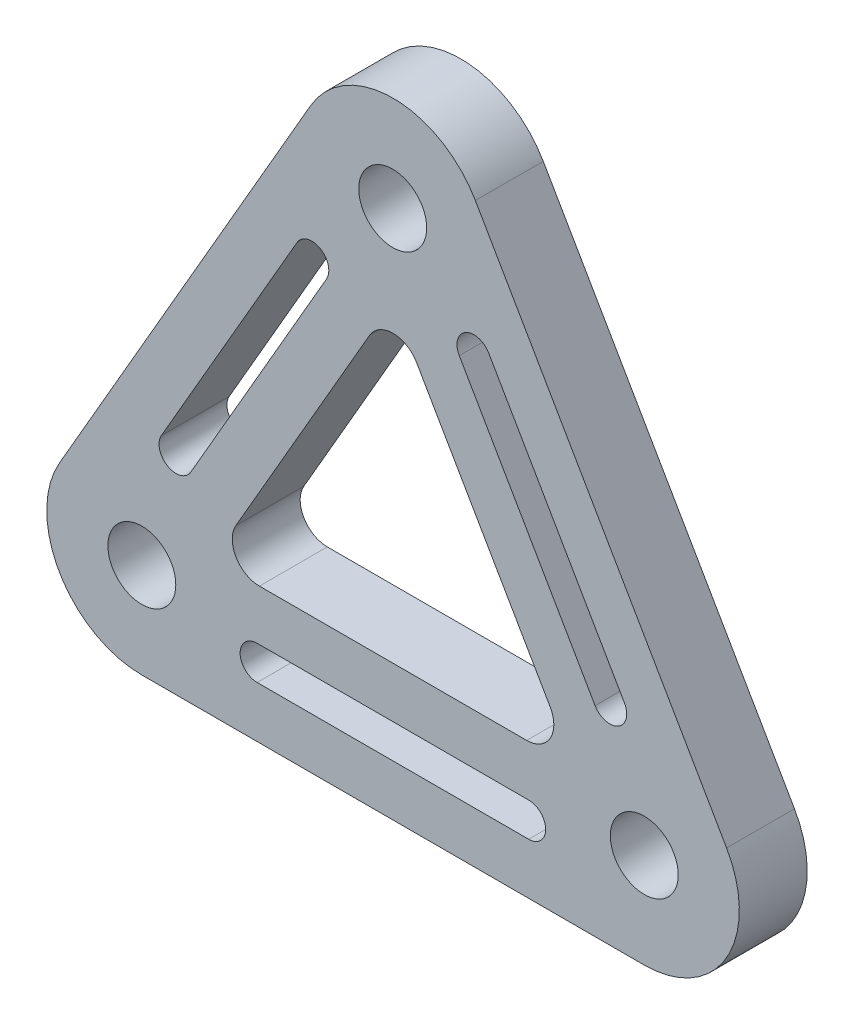
ISO-10303-21;
HEADER;
FILE_DESCRIPTION(('STEP AP214'),'2;1');
FILE_NAME('part.step','',(''),(''),'','','');
FILE_SCHEMA(('AUTOMOTIVE_DESIGN { 1 0 10303 214 1 1 1 1 }'));
ENDSEC;
DATA;
#1=APPLICATION_CONTEXT('core data for automotive mechanical design processes');
#2=APPLICATION_PROTOCOL_DEFINITION('international standard','automotive_design',2000,#1);
#3=PRODUCT_CONTEXT('',#1,'mechanical');
#4=PRODUCT('Part','Part','',(#3));
#5=PRODUCT_RELATED_PRODUCT_CATEGORY('part','',(#4));
#6=PRODUCT_DEFINITION_FORMATION('','',#4);
#7=PRODUCT_DEFINITION_CONTEXT('part definition',#1,'design');
#8=PRODUCT_DEFINITION('design','',#6,#7);
#9=PRODUCT_DEFINITION_SHAPE('','',#8);
#10=(LENGTH_UNIT() NAMED_UNIT(*) SI_UNIT(.MILLI.,.METRE.));
#11=(NAMED_UNIT(*) PLANE_ANGLE_UNIT() SI_UNIT($,.RADIAN.));
#12=(NAMED_UNIT(*) SI_UNIT($,.STERADIAN.) SOLID_ANGLE_UNIT());
#13=UNCERTAINTY_MEASURE_WITH_UNIT(LENGTH_MEASURE(1.E-05),#10,'distance_accuracy_value','');
#14=(GEOMETRIC_REPRESENTATION_CONTEXT(3) GLOBAL_UNCERTAINTY_ASSIGNED_CONTEXT((#13)) GLOBAL_UNIT_ASSIGNED_CONTEXT((#10,
#11,#12)) REPRESENTATION_CONTEXT('',''));
#15=CARTESIAN_POINT('',(0.,0.,0.));
#16=DIRECTION('',(0.,0.,1.));
#17=DIRECTION('',(1.,0.,0.));
#18=AXIS2_PLACEMENT_3D('',#15,#16,#17);
#19=CARTESIAN_POINT('',(39.1045793584766,-10.7208480493651,6.35));
#20=DIRECTION('',(0.,0.,-1.));
#21=DIRECTION('',(-1.,0.,0.));
#22=AXIS2_PLACEMENT_3D('',#19,#20,#21);
#23=PLANE('',#22);
#24=CARTESIAN_POINT('',(26.3903000994662,-53.9306493710956,6.35));
#25=DIRECTION('',(0.,0.,1.));
#26=DIRECTION('',(1.,0.,0.));
#27=AXIS2_PLACEMENT_3D('',#24,#25,#26);
#28=CIRCLE('',#27,1.5875);
#29=CARTESIAN_POINT('',(26.3903000994662,-52.3431493710956,6.35));
#30=VERTEX_POINT('',#29);
#31=CARTESIAN_POINT('',(26.3903000994662,-55.5181493710956,6.35));
#32=VERTEX_POINT('',#31);
#33=EDGE_CURVE('E220',#30,#32,#28,.T.);
#34=ORIENTED_EDGE('',*,*,#33,.F.);
#35=DIRECTION('',(-1.,0.,0.));
#36=VECTOR('',#35,1.);
#37=CARTESIAN_POINT('',(-4.86177993811086E-13,-52.3431493710954,6.35));
#38=LINE('',#37,#36);
#39=CARTESIAN_POINT('',(51.7903000994662,-52.3431493710959,6.35));
#40=VERTEX_POINT('',#39);
#41=EDGE_CURVE('E48',#40,#30,#38,.T.);
#42=ORIENTED_EDGE('',*,*,#41,.F.);
#43=CARTESIAN_POINT('',(51.7903000994662,-53.9306493710959,6.35));
#44=DIRECTION('',(0.,0.,1.));
#45=DIRECTION('',(1.,0.,0.));
#46=AXIS2_PLACEMENT_3D('',#43,#44,#45);
#47=CIRCLE('',#46,1.5875);
#48=CARTESIAN_POINT('',(51.7903000994662,-55.5181493710959,6.35));
#49=VERTEX_POINT('',#48);
#50=EDGE_CURVE('E211',#49,#40,#47,.T.);
#51=ORIENTED_EDGE('',*,*,#50,.F.);
#52=DIRECTION('',(-1.,0.,0.));
#53=VECTOR('',#52,1.);
#54=CARTESIAN_POINT('',(-5.15668292902691E-13,-55.5181493710954,6.35));
#55=LINE('',#54,#53);
#56=EDGE_CURVE('E214',#49,#32,#55,.T.);
#57=ORIENTED_EDGE('',*,*,#56,.T.);
#58=EDGE_LOOP('',(#34,#42,#51,#57));
#59=FACE_BOUND('',#58,.T.);
#60=CARTESIAN_POINT('',(59.3732253660686,-40.796637539343,6.35));
#61=DIRECTION('',(0.,0.,1.));
#62=DIRECTION('',(1.,0.,0.));
#63=AXIS2_PLACEMENT_3D('',#60,#61,#62);
#64=CIRCLE('',#63,1.5875);
#65=CARTESIAN_POINT('',(57.9984100375608,-41.590387539343,6.35));
#66=VERTEX_POINT('',#65);
#67=CARTESIAN_POINT('',(60.7480406945764,-40.002887539343,6.35));
#68=VERTEX_POINT('',#67);
#69=EDGE_CURVE('E245',#66,#68,#64,.T.);
#70=ORIENTED_EDGE('',*,*,#69,.F.);
#71=DIRECTION('',(0.499999999999996,-0.866025403784441,0.));
#72=VECTOR('',#71,1.);
#73=CARTESIAN_POINT('',(25.4896414470155,14.7164513509813,6.35));
#74=LINE('',#73,#72);
#75=CARTESIAN_POINT('',(45.2984100375609,-19.5933422832182,6.35));
#76=VERTEX_POINT('',#75);
#77=EDGE_CURVE('E226',#76,#66,#74,.T.);
#78=ORIENTED_EDGE('',*,*,#77,.F.);
#79=CARTESIAN_POINT('',(46.6732253660687,-18.7995922832182,6.35));
#80=DIRECTION('',(0.,0.,1.));
#81=DIRECTION('',(1.,0.,0.));
#82=AXIS2_PLACEMENT_3D('',#79,#80,#81);
#83=CIRCLE('',#82,1.5875);
#84=CARTESIAN_POINT('',(48.0480406945765,-18.0058422832182,6.35));
#85=VERTEX_POINT('',#84);
#86=EDGE_CURVE('E234',#85,#76,#83,.T.);
#87=ORIENTED_EDGE('',*,*,#86,.F.);
#88=DIRECTION('',(0.499999999999996,-0.866025403784441,0.));
#89=VECTOR('',#88,1.);
#90=CARTESIAN_POINT('',(28.2392721040311,16.3039513509813,6.35));
#91=LINE('',#90,#89);
#92=EDGE_CURVE('E248',#85,#68,#91,.T.);
#93=ORIENTED_EDGE('',*,*,#92,.T.);
#94=EDGE_LOOP('',(#70,#78,#87,#93));
#95=FACE_BOUND('',#94,.T.);
#96=CARTESIAN_POINT('',(31.5073748328641,-18.7995922832182,6.35));
#97=DIRECTION('',(0.,0.,1.));
#98=DIRECTION('',(1.,0.,0.));
#99=AXIS2_PLACEMENT_3D('',#96,#97,#98);
#100=CIRCLE('',#99,1.5875);
#101=CARTESIAN_POINT('',(32.8821901613719,-19.5933422832181,6.35));
#102=VERTEX_POINT('',#101);
#103=CARTESIAN_POINT('',(30.1325595043563,-18.0058422832182,6.35));
#104=VERTEX_POINT('',#103);
#105=EDGE_CURVE('E277',#102,#104,#100,.T.);
#106=ORIENTED_EDGE('',*,*,#105,.F.);
#107=DIRECTION('',(0.5,0.866025403784439,0.));
#108=VECTOR('',#107,1.);
#109=CARTESIAN_POINT('',(33.1458087021843,-19.1367415767139,6.35));
#110=LINE('',#109,#108);
#111=CARTESIAN_POINT('',(20.1821901613719,-41.5903875393429,6.35));
#112=VERTEX_POINT('',#111);
#113=EDGE_CURVE('E255',#112,#102,#110,.T.);
#114=ORIENTED_EDGE('',*,*,#113,.F.);
#115=CARTESIAN_POINT('',(18.8073748328641,-40.7966375393429,6.35));
#116=DIRECTION('',(0.,0.,1.));
#117=DIRECTION('',(1.,0.,0.));
#118=AXIS2_PLACEMENT_3D('',#115,#116,#117);
#119=CIRCLE('',#118,1.5875);
#120=CARTESIAN_POINT('',(17.4325595043563,-40.0028875393429,6.35));
#121=VERTEX_POINT('',#120);
#122=EDGE_CURVE('E266',#121,#112,#119,.T.);
#123=ORIENTED_EDGE('',*,*,#122,.F.);
#124=DIRECTION('',(0.5,0.866025403784439,0.));
#125=VECTOR('',#124,1.);
#126=CARTESIAN_POINT('',(30.3961780451687,-17.5492415767139,6.35));
#127=LINE('',#126,#125);
#128=EDGE_CURVE('E280',#121,#104,#127,.T.);
#129=ORIENTED_EDGE('',*,*,#128,.T.);
#130=EDGE_LOOP('',(#106,#114,#123,#129));
#131=FACE_BOUND('',#130,.T.);
#132=CARTESIAN_POINT('',(39.1045793584766,-10.7208480493651,6.35));
#133=DIRECTION('',(0.,0.,1.));
#134=DIRECTION('',(-1.,0.,0.));
#135=AXIS2_PLACEMENT_3D('',#132,#133,#134);
#136=CIRCLE('',#135,8.89);
#137=CARTESIAN_POINT('',(46.8035451981202,-6.27584804936509,6.35));
#138=VERTEX_POINT('',#137);
#139=CARTESIAN_POINT('',(31.4056135188329,-6.27584804936512,6.35));
#140=VERTEX_POINT('',#139);
#141=EDGE_CURVE('E357',#138,#140,#136,.T.);
#142=ORIENTED_EDGE('',*,*,#141,.T.);
#143=DIRECTION('',(-0.5,-0.866025403784438,0.));
#144=VECTOR('',#143,1.);
#145=CARTESIAN_POINT('',(31.4056135188329,-6.27584804936512,6.35));
#146=LINE('',#145,#144);
#147=CARTESIAN_POINT('',(7.91061351883288,-46.9703817731959,6.35));
#148=VERTEX_POINT('',#147);
#149=EDGE_CURVE('E360',#140,#148,#146,.T.);
#150=ORIENTED_EDGE('',*,*,#149,.T.);
#151=CARTESIAN_POINT('',(15.6095793584766,-51.4153817731959,6.35));
#152=DIRECTION('',(0.,0.,1.));
#153=DIRECTION('',(1.,0.,0.));
#154=AXIS2_PLACEMENT_3D('',#151,#152,#153);
#155=CIRCLE('',#154,8.89000000000002);
#156=CARTESIAN_POINT('',(15.6095793584766,-60.3053817731959,6.35));
#157=VERTEX_POINT('',#156);
#158=EDGE_CURVE('E363',#148,#157,#155,.T.);
#159=ORIENTED_EDGE('',*,*,#158,.T.);
#160=DIRECTION('',(1.,0.,0.));
#161=VECTOR('',#160,1.);
#162=CARTESIAN_POINT('',(15.6095793584766,-60.3053817731959,6.35));
#163=LINE('',#162,#161);
#164=CARTESIAN_POINT('',(62.5995793584767,-60.3053817731958,6.35));
#165=VERTEX_POINT('',#164);
#166=EDGE_CURVE('E365',#157,#165,#163,.T.);
#167=ORIENTED_EDGE('',*,*,#166,.T.);
#168=CARTESIAN_POINT('',(62.5995793584766,-51.4153817731959,6.35));
#169=DIRECTION('',(0.,0.,1.));
#170=DIRECTION('',(1.,0.,0.));
#171=AXIS2_PLACEMENT_3D('',#168,#169,#170);
#172=CIRCLE('',#171,8.88999999999999);
#173=CARTESIAN_POINT('',(70.2985451981203,-46.9703817731959,6.35));
#174=VERTEX_POINT('',#173);
#175=EDGE_CURVE('E367',#165,#174,#172,.T.);
#176=ORIENTED_EDGE('',*,*,#175,.T.);
#177=DIRECTION('',(-0.500000000000002,0.866025403784438,0.));
#178=VECTOR('',#177,1.);
#179=CARTESIAN_POINT('',(70.2985451981203,-46.9703817731959,6.35));
#180=LINE('',#179,#178);
#181=EDGE_CURVE('E369',#174,#138,#180,.T.);
#182=ORIENTED_EDGE('',*,*,#181,.T.);
#183=EDGE_LOOP('',(#142,#150,#159,#167,#176,#182));
#184=FACE_BOUND('',#183,.T.);
#185=CARTESIAN_POINT('',(26.6081019865389,-45.0653817731959,6.35));
#186=DIRECTION('',(0.,0.,1.));
#187=DIRECTION('',(-1.,0.,0.));
#188=AXIS2_PLACEMENT_3D('',#185,#186,#187);
#189=CIRCLE('',#188,2.54);
#190=CARTESIAN_POINT('',(24.4083974609265,-43.7953817731959,6.35));
#191=VERTEX_POINT('',#190);
#192=CARTESIAN_POINT('',(26.608101986539,-47.6053817731959,6.35));
#193=VERTEX_POINT('',#192);
#194=EDGE_CURVE('E312',#191,#193,#189,.T.);
#195=ORIENTED_EDGE('',*,*,#194,.F.);
#196=DIRECTION('',(-0.5,-0.866025403784438,0.));
#197=VECTOR('',#196,1.);
#198=CARTESIAN_POINT('',(36.9048748328641,-22.1508480493651,6.35));
#199=LINE('',#198,#197);
#200=CARTESIAN_POINT('',(36.9048748328641,-22.1508480493651,6.35));
#201=VERTEX_POINT('',#200);
#202=EDGE_CURVE('E324',#201,#191,#199,.T.);
#203=ORIENTED_EDGE('',*,*,#202,.F.);
#204=CARTESIAN_POINT('',(39.1045793584766,-23.420848049365,6.35));
#205=DIRECTION('',(0.,0.,1.));
#206=DIRECTION('',(1.,0.,0.));
#207=AXIS2_PLACEMENT_3D('',#204,#205,#206);
#208=CIRCLE('',#207,2.54);
#209=CARTESIAN_POINT('',(41.3042838840891,-22.1508480493651,6.35));
#210=VERTEX_POINT('',#209);
#211=EDGE_CURVE('E321',#210,#201,#208,.T.);
#212=ORIENTED_EDGE('',*,*,#211,.F.);
#213=DIRECTION('',(-0.5,0.866025403784438,0.));
#214=VECTOR('',#213,1.);
#215=CARTESIAN_POINT('',(53.8007612560268,-43.7953817731959,6.35));
#216=LINE('',#215,#214);
#217=CARTESIAN_POINT('',(53.8007612560268,-43.7953817731959,6.35));
#218=VERTEX_POINT('',#217);
#219=EDGE_CURVE('E319',#218,#210,#216,.T.);
#220=ORIENTED_EDGE('',*,*,#219,.F.);
#221=CARTESIAN_POINT('',(51.6010567304143,-45.0653817731959,6.35));
#222=DIRECTION('',(0.,0.,1.));
#223=DIRECTION('',(1.,0.,0.));
#224=AXIS2_PLACEMENT_3D('',#221,#222,#223);
#225=CIRCLE('',#224,2.54);
#226=CARTESIAN_POINT('',(51.6010567304143,-47.6053817731959,6.35));
#227=VERTEX_POINT('',#226);
#228=EDGE_CURVE('E317',#227,#218,#225,.T.);
#229=ORIENTED_EDGE('',*,*,#228,.F.);
#230=DIRECTION('',(1.,0.,0.));
#231=VECTOR('',#230,1.);
#232=CARTESIAN_POINT('',(26.608101986539,-47.6053817731959,6.35));
#233=LINE('',#232,#231);
#234=EDGE_CURVE('E314',#193,#227,#233,.T.);
#235=ORIENTED_EDGE('',*,*,#234,.F.);
#236=EDGE_LOOP('',(#195,#203,#212,#220,#229,#235));
#237=FACE_BOUND('',#236,.T.);
#238=CARTESIAN_POINT('',(39.0730942983429,-10.7753817731959,6.35));
#239=DIRECTION('',(0.,0.,1.));
#240=DIRECTION('',(1.,0.,0.));
#241=AXIS2_PLACEMENT_3D('',#238,#239,#240);
#242=CIRCLE('',#241,3.175);
#243=CARTESIAN_POINT('',(42.2480942983429,-10.7753817731959,6.35));
#244=VERTEX_POINT('',#243);
#245=EDGE_CURVE('E303',#244,#244,#242,.T.);
#246=ORIENTED_EDGE('',*,*,#245,.F.);
#247=EDGE_LOOP('',(#246));
#248=FACE_BOUND('',#247,.T.);
#249=CARTESIAN_POINT('',(62.5995793584766,-51.4153817731959,6.35));
#250=DIRECTION('',(0.,0.,1.));
#251=DIRECTION('',(1.,0.,0.));
#252=AXIS2_PLACEMENT_3D('',#249,#250,#251);
#253=CIRCLE('',#252,3.175);
#254=CARTESIAN_POINT('',(65.7745793584766,-51.4153817731959,6.35));
#255=VERTEX_POINT('',#254);
#256=EDGE_CURVE('E297',#255,#255,#253,.T.);
#257=ORIENTED_EDGE('',*,*,#256,.F.);
#258=EDGE_LOOP('',(#257));
#259=FACE_BOUND('',#258,.T.);
#260=CARTESIAN_POINT('',(15.6095793584765,-51.4153817731959,6.35));
#261=DIRECTION('',(0.,0.,1.));
#262=DIRECTION('',(1.,0.,0.));
#263=AXIS2_PLACEMENT_3D('',#260,#261,#262);
#264=CIRCLE('',#263,3.175);
#265=CARTESIAN_POINT('',(18.7845793584765,-51.4153817731959,6.35));
#266=VERTEX_POINT('',#265);
#267=EDGE_CURVE('E287',#266,#266,#264,.T.);
#268=ORIENTED_EDGE('',*,*,#267,.F.);
#269=EDGE_LOOP('',(#268));
#270=FACE_BOUND('',#269,.T.);
#271=ADVANCED_FACE('F33',(#59,#95,#131,#184,#237,#248,#259,#270),#23,.F.);
#272=CARTESIAN_POINT('',(39.1045793584766,-10.7208480493651,0.));
#273=DIRECTION('',(0.,0.,-1.));
#274=DIRECTION('',(-1.,0.,0.));
#275=AXIS2_PLACEMENT_3D('',#272,#273,#274);
#276=PLANE('',#275);
#277=DIRECTION('',(-1.,0.,0.));
#278=VECTOR('',#277,1.);
#279=CARTESIAN_POINT('',(-4.86177993811086E-13,-52.3431493710954,0.));
#280=LINE('',#279,#278);
#281=CARTESIAN_POINT('',(51.7903000994662,-52.3431493710959,0.));
#282=VERTEX_POINT('',#281);
#283=CARTESIAN_POINT('',(26.3903000994662,-52.3431493710956,0.));
#284=VERTEX_POINT('',#283);
#285=EDGE_CURVE('E196',#282,#284,#280,.T.);
#286=ORIENTED_EDGE('',*,*,#285,.T.);
#287=CARTESIAN_POINT('',(26.3903000994662,-53.9306493710956,0.));
#288=DIRECTION('',(0.,0.,1.));
#289=DIRECTION('',(1.,0.,0.));
#290=AXIS2_PLACEMENT_3D('',#287,#288,#289);
#291=CIRCLE('',#290,1.5875);
#292=CARTESIAN_POINT('',(26.3903000994662,-55.5181493710956,0.));
#293=VERTEX_POINT('',#292);
#294=EDGE_CURVE('E202',#284,#293,#291,.T.);
#295=ORIENTED_EDGE('',*,*,#294,.T.);
#296=DIRECTION('',(-1.,0.,0.));
#297=VECTOR('',#296,1.);
#298=CARTESIAN_POINT('',(-5.15668292902691E-13,-55.5181493710954,0.));
#299=LINE('',#298,#297);
#300=CARTESIAN_POINT('',(51.7903000994662,-55.5181493710959,0.));
#301=VERTEX_POINT('',#300);
#302=EDGE_CURVE('E206',#301,#293,#299,.T.);
#303=ORIENTED_EDGE('',*,*,#302,.F.);
#304=CARTESIAN_POINT('',(51.7903000994662,-53.9306493710959,0.));
#305=DIRECTION('',(0.,0.,1.));
#306=DIRECTION('',(1.,0.,0.));
#307=AXIS2_PLACEMENT_3D('',#304,#305,#306);
#308=CIRCLE('',#307,1.5875);
#309=EDGE_CURVE('E199',#301,#282,#308,.T.);
#310=ORIENTED_EDGE('',*,*,#309,.T.);
#311=EDGE_LOOP('',(#286,#295,#303,#310));
#312=FACE_BOUND('',#311,.T.);
#313=DIRECTION('',(0.499999999999996,-0.866025403784441,0.));
#314=VECTOR('',#313,1.);
#315=CARTESIAN_POINT('',(25.4896414470155,14.7164513509813,0.));
#316=LINE('',#315,#314);
#317=CARTESIAN_POINT('',(45.2984100375609,-19.5933422832182,0.));
#318=VERTEX_POINT('',#317);
#319=CARTESIAN_POINT('',(57.9984100375608,-41.590387539343,0.));
#320=VERTEX_POINT('',#319);
#321=EDGE_CURVE('E230',#318,#320,#316,.T.);
#322=ORIENTED_EDGE('',*,*,#321,.T.);
#323=CARTESIAN_POINT('',(59.3732253660686,-40.796637539343,0.));
#324=DIRECTION('',(0.,0.,1.));
#325=DIRECTION('',(1.,0.,0.));
#326=AXIS2_PLACEMENT_3D('',#323,#324,#325);
#327=CIRCLE('',#326,1.5875);
#328=CARTESIAN_POINT('',(60.7480406945764,-40.002887539343,0.));
#329=VERTEX_POINT('',#328);
#330=EDGE_CURVE('E233',#320,#329,#327,.T.);
#331=ORIENTED_EDGE('',*,*,#330,.T.);
#332=DIRECTION('',(0.499999999999996,-0.866025403784441,0.));
#333=VECTOR('',#332,1.);
#334=CARTESIAN_POINT('',(28.2392721040311,16.3039513509813,0.));
#335=LINE('',#334,#333);
#336=CARTESIAN_POINT('',(48.0480406945765,-18.0058422832182,0.));
#337=VERTEX_POINT('',#336);
#338=EDGE_CURVE('E237',#337,#329,#335,.T.);
#339=ORIENTED_EDGE('',*,*,#338,.F.);
#340=CARTESIAN_POINT('',(46.6732253660687,-18.7995922832182,0.));
#341=DIRECTION('',(0.,0.,1.));
#342=DIRECTION('',(1.,0.,0.));
#343=AXIS2_PLACEMENT_3D('',#340,#341,#342);
#344=CIRCLE('',#343,1.5875);
#345=EDGE_CURVE('E240',#337,#318,#344,.T.);
#346=ORIENTED_EDGE('',*,*,#345,.T.);
#347=EDGE_LOOP('',(#322,#331,#339,#346));
#348=FACE_BOUND('',#347,.T.);
#349=DIRECTION('',(0.5,0.866025403784439,0.));
#350=VECTOR('',#349,1.);
#351=CARTESIAN_POINT('',(33.1458087021843,-19.1367415767139,0.));
#352=LINE('',#351,#350);
#353=CARTESIAN_POINT('',(20.1821901613719,-41.5903875393429,0.));
#354=VERTEX_POINT('',#353);
#355=CARTESIAN_POINT('',(32.8821901613719,-19.5933422832181,0.));
#356=VERTEX_POINT('',#355);
#357=EDGE_CURVE('E262',#354,#356,#352,.T.);
#358=ORIENTED_EDGE('',*,*,#357,.T.);
#359=CARTESIAN_POINT('',(31.5073748328641,-18.7995922832182,0.));
#360=DIRECTION('',(0.,0.,1.));
#361=DIRECTION('',(1.,0.,0.));
#362=AXIS2_PLACEMENT_3D('',#359,#360,#361);
#363=CIRCLE('',#362,1.5875);
#364=CARTESIAN_POINT('',(30.1325595043563,-18.0058422832182,0.));
#365=VERTEX_POINT('',#364);
#366=EDGE_CURVE('E265',#356,#365,#363,.T.);
#367=ORIENTED_EDGE('',*,*,#366,.T.);
#368=DIRECTION('',(0.5,0.866025403784439,0.));
#369=VECTOR('',#368,1.);
#370=CARTESIAN_POINT('',(30.3961780451687,-17.5492415767139,0.));
#371=LINE('',#370,#369);
#372=CARTESIAN_POINT('',(17.4325595043563,-40.0028875393429,0.));
#373=VERTEX_POINT('',#372);
#374=EDGE_CURVE('E269',#373,#365,#371,.T.);
#375=ORIENTED_EDGE('',*,*,#374,.F.);
#376=CARTESIAN_POINT('',(18.8073748328641,-40.7966375393429,0.));
#377=DIRECTION('',(0.,0.,1.));
#378=DIRECTION('',(1.,0.,0.));
#379=AXIS2_PLACEMENT_3D('',#376,#377,#378);
#380=CIRCLE('',#379,1.5875);
#381=EDGE_CURVE('E272',#373,#354,#380,.T.);
#382=ORIENTED_EDGE('',*,*,#381,.T.);
#383=EDGE_LOOP('',(#358,#367,#375,#382));
#384=FACE_BOUND('',#383,.T.);
#385=CARTESIAN_POINT('',(39.1045793584766,-10.7208480493651,0.));
#386=DIRECTION('',(0.,0.,1.));
#387=DIRECTION('',(-1.,0.,0.));
#388=AXIS2_PLACEMENT_3D('',#385,#386,#387);
#389=CIRCLE('',#388,8.89);
#390=CARTESIAN_POINT('',(46.8035451981202,-6.27584804936509,0.));
#391=VERTEX_POINT('',#390);
#392=CARTESIAN_POINT('',(31.4056135188329,-6.27584804936512,0.));
#393=VERTEX_POINT('',#392);
#394=EDGE_CURVE('E356',#391,#393,#389,.T.);
#395=ORIENTED_EDGE('',*,*,#394,.F.);
#396=DIRECTION('',(-0.500000000000002,0.866025403784438,0.));
#397=VECTOR('',#396,1.);
#398=CARTESIAN_POINT('',(70.2985451981203,-46.9703817731959,0.));
#399=LINE('',#398,#397);
#400=CARTESIAN_POINT('',(70.2985451981203,-46.9703817731959,0.));
#401=VERTEX_POINT('',#400);
#402=EDGE_CURVE('E361',#401,#391,#399,.T.);
#403=ORIENTED_EDGE('',*,*,#402,.F.);
#404=CARTESIAN_POINT('',(62.5995793584766,-51.4153817731959,0.));
#405=DIRECTION('',(0.,0.,1.));
#406=DIRECTION('',(1.,0.,0.));
#407=AXIS2_PLACEMENT_3D('',#404,#405,#406);
#408=CIRCLE('',#407,8.88999999999999);
#409=CARTESIAN_POINT('',(62.5995793584767,-60.3053817731958,0.));
#410=VERTEX_POINT('',#409);
#411=EDGE_CURVE('E380',#410,#401,#408,.T.);
#412=ORIENTED_EDGE('',*,*,#411,.F.);
#413=DIRECTION('',(1.,0.,0.));
#414=VECTOR('',#413,1.);
#415=CARTESIAN_POINT('',(15.6095793584766,-60.3053817731959,0.));
#416=LINE('',#415,#414);
#417=CARTESIAN_POINT('',(15.6095793584766,-60.3053817731959,0.));
#418=VERTEX_POINT('',#417);
#419=EDGE_CURVE('E378',#418,#410,#416,.T.);
#420=ORIENTED_EDGE('',*,*,#419,.F.);
#421=CARTESIAN_POINT('',(15.6095793584766,-51.4153817731959,0.));
#422=DIRECTION('',(0.,0.,1.));
#423=DIRECTION('',(1.,0.,0.));
#424=AXIS2_PLACEMENT_3D('',#421,#422,#423);
#425=CIRCLE('',#424,8.89000000000002);
#426=CARTESIAN_POINT('',(7.91061351883288,-46.9703817731959,0.));
#427=VERTEX_POINT('',#426);
#428=EDGE_CURVE('E376',#427,#418,#425,.T.);
#429=ORIENTED_EDGE('',*,*,#428,.F.);
#430=DIRECTION('',(-0.5,-0.866025403784438,0.));
#431=VECTOR('',#430,1.);
#432=CARTESIAN_POINT('',(31.4056135188329,-6.27584804936512,0.));
#433=LINE('',#432,#431);
#434=EDGE_CURVE('E374',#393,#427,#433,.T.);
#435=ORIENTED_EDGE('',*,*,#434,.F.);
#436=EDGE_LOOP('',(#395,#403,#412,#420,#429,#435));
#437=FACE_BOUND('',#436,.T.);
#438=DIRECTION('',(-0.5,-0.866025403784438,0.));
#439=VECTOR('',#438,1.);
#440=CARTESIAN_POINT('',(36.9048748328641,-22.1508480493651,0.));
#441=LINE('',#440,#439);
#442=CARTESIAN_POINT('',(36.9048748328641,-22.1508480493651,0.));
#443=VERTEX_POINT('',#442);
#444=CARTESIAN_POINT('',(24.4083974609265,-43.7953817731959,0.));
#445=VERTEX_POINT('',#444);
#446=EDGE_CURVE('E315',#443,#445,#441,.T.);
#447=ORIENTED_EDGE('',*,*,#446,.T.);
#448=CARTESIAN_POINT('',(26.6081019865389,-45.0653817731959,0.));
#449=DIRECTION('',(0.,0.,1.));
#450=DIRECTION('',(-1.,0.,0.));
#451=AXIS2_PLACEMENT_3D('',#448,#449,#450);
#452=CIRCLE('',#451,2.54);
#453=CARTESIAN_POINT('',(26.608101986539,-47.6053817731959,0.));
#454=VERTEX_POINT('',#453);
#455=EDGE_CURVE('E309',#445,#454,#452,.T.);
#456=ORIENTED_EDGE('',*,*,#455,.T.);
#457=DIRECTION('',(1.,0.,0.));
#458=VECTOR('',#457,1.);
#459=CARTESIAN_POINT('',(26.608101986539,-47.6053817731959,0.));
#460=LINE('',#459,#458);
#461=CARTESIAN_POINT('',(51.6010567304143,-47.6053817731959,0.));
#462=VERTEX_POINT('',#461);
#463=EDGE_CURVE('E329',#454,#462,#460,.T.);
#464=ORIENTED_EDGE('',*,*,#463,.T.);
#465=CARTESIAN_POINT('',(51.6010567304143,-45.0653817731959,0.));
#466=DIRECTION('',(0.,0.,1.));
#467=DIRECTION('',(1.,0.,0.));
#468=AXIS2_PLACEMENT_3D('',#465,#466,#467);
#469=CIRCLE('',#468,2.54);
#470=CARTESIAN_POINT('',(53.8007612560268,-43.7953817731959,0.));
#471=VERTEX_POINT('',#470);
#472=EDGE_CURVE('E332',#462,#471,#469,.T.);
#473=ORIENTED_EDGE('',*,*,#472,.T.);
#474=DIRECTION('',(-0.5,0.866025403784438,0.));
#475=VECTOR('',#474,1.);
#476=CARTESIAN_POINT('',(53.8007612560268,-43.7953817731959,0.));
#477=LINE('',#476,#475);
#478=CARTESIAN_POINT('',(41.3042838840891,-22.1508480493651,0.));
#479=VERTEX_POINT('',#478);
#480=EDGE_CURVE('E335',#471,#479,#477,.T.);
#481=ORIENTED_EDGE('',*,*,#480,.T.);
#482=CARTESIAN_POINT('',(39.1045793584766,-23.420848049365,0.));
#483=DIRECTION('',(0.,0.,1.));
#484=DIRECTION('',(1.,0.,0.));
#485=AXIS2_PLACEMENT_3D('',#482,#483,#484);
#486=CIRCLE('',#485,2.54);
#487=EDGE_CURVE('E338',#479,#443,#486,.T.);
#488=ORIENTED_EDGE('',*,*,#487,.T.);
#489=EDGE_LOOP('',(#447,#456,#464,#473,#481,#488));
#490=FACE_BOUND('',#489,.T.);
#491=CARTESIAN_POINT('',(39.0730942983429,-10.7753817731959,0.));
#492=DIRECTION('',(0.,0.,1.));
#493=DIRECTION('',(1.,0.,0.));
#494=AXIS2_PLACEMENT_3D('',#491,#492,#493);
#495=CIRCLE('',#494,3.175);
#496=CARTESIAN_POINT('',(42.2480942983429,-10.7753817731959,0.));
#497=VERTEX_POINT('',#496);
#498=EDGE_CURVE('E306',#497,#497,#495,.T.);
#499=ORIENTED_EDGE('',*,*,#498,.T.);
#500=EDGE_LOOP('',(#499));
#501=FACE_BOUND('',#500,.T.);
#502=CARTESIAN_POINT('',(62.5995793584766,-51.4153817731959,0.));
#503=DIRECTION('',(0.,0.,1.));
#504=DIRECTION('',(1.,0.,0.));
#505=AXIS2_PLACEMENT_3D('',#502,#503,#504);
#506=CIRCLE('',#505,3.175);
#507=CARTESIAN_POINT('',(65.7745793584766,-51.4153817731959,0.));
#508=VERTEX_POINT('',#507);
#509=EDGE_CURVE('E300',#508,#508,#506,.T.);
#510=ORIENTED_EDGE('',*,*,#509,.T.);
#511=EDGE_LOOP('',(#510));
#512=FACE_BOUND('',#511,.T.);
#513=CARTESIAN_POINT('',(15.6095793584765,-51.4153817731959,0.));
#514=DIRECTION('',(0.,0.,1.));
#515=DIRECTION('',(1.,0.,0.));
#516=AXIS2_PLACEMENT_3D('',#513,#514,#515);
#517=CIRCLE('',#516,3.175);
#518=CARTESIAN_POINT('',(18.7845793584765,-51.4153817731959,0.));
#519=VERTEX_POINT('',#518);
#520=EDGE_CURVE('E294',#519,#519,#517,.T.);
#521=ORIENTED_EDGE('',*,*,#520,.T.);
#522=EDGE_LOOP('',(#521));
#523=FACE_BOUND('',#522,.T.);
#524=ADVANCED_FACE('F208',(#312,#348,#384,#437,#490,#501,#512,#523),#276,.T.);
#525=CARTESIAN_POINT('',(39.1045793584766,-10.7208480493651,6.35));
#526=DIRECTION('',(0.,0.,-1.));
#527=DIRECTION('',(-1.,0.,0.));
#528=AXIS2_PLACEMENT_3D('',#525,#526,#527);
#529=CYLINDRICAL_SURFACE('',#528,8.89);
#530=ORIENTED_EDGE('',*,*,#394,.T.);
#531=DIRECTION('',(0.,0.,-1.));
#532=VECTOR('',#531,1.);
#533=CARTESIAN_POINT('',(31.4056135188329,-6.27584804936512,6.35));
#534=LINE('',#533,#532);
#535=EDGE_CURVE('E11',#140,#393,#534,.T.);
#536=ORIENTED_EDGE('',*,*,#535,.F.);
#537=ORIENTED_EDGE('',*,*,#141,.F.);
#538=DIRECTION('',(0.,0.,-1.));
#539=VECTOR('',#538,1.);
#540=CARTESIAN_POINT('',(46.8035451981202,-6.27584804936509,6.35));
#541=LINE('',#540,#539);
#542=EDGE_CURVE('E371',#138,#391,#541,.T.);
#543=ORIENTED_EDGE('',*,*,#542,.T.);
#544=EDGE_LOOP('',(#530,#536,#537,#543));
#545=FACE_BOUND('',#544,.T.);
#546=ADVANCED_FACE('F35',(#545),#529,.T.);
#547=CARTESIAN_POINT('',(31.4056135188329,-6.27584804936512,6.35));
#548=DIRECTION('',(0.866025403784438,-0.5,0.));
#549=DIRECTION('',(0.5,0.866025403784438,0.));
#550=AXIS2_PLACEMENT_3D('',#547,#548,#549);
#551=PLANE('',#550);
#552=ORIENTED_EDGE('',*,*,#434,.T.);
#553=DIRECTION('',(0.,0.,-1.));
#554=VECTOR('',#553,1.);
#555=CARTESIAN_POINT('',(7.91061351883288,-46.9703817731959,6.35));
#556=LINE('',#555,#554);
#557=EDGE_CURVE('E41',#148,#427,#556,.T.);
#558=ORIENTED_EDGE('',*,*,#557,.F.);
#559=ORIENTED_EDGE('',*,*,#149,.F.);
#560=ORIENTED_EDGE('',*,*,#535,.T.);
#561=EDGE_LOOP('',(#552,#558,#559,#560));
#562=FACE_BOUND('',#561,.T.);
#563=ADVANCED_FACE('F421',(#562),#551,.F.);
#564=CARTESIAN_POINT('',(15.6095793584766,-51.4153817731959,6.35));
#565=DIRECTION('',(0.,0.,-1.));
#566=DIRECTION('',(-1.,0.,0.));
#567=AXIS2_PLACEMENT_3D('',#564,#565,#566);
#568=CYLINDRICAL_SURFACE('',#567,8.89000000000002);
#569=ORIENTED_EDGE('',*,*,#428,.T.);
#570=DIRECTION('',(0.,0.,-1.));
#571=VECTOR('',#570,1.);
#572=CARTESIAN_POINT('',(15.6095793584766,-60.3053817731959,6.35));
#573=LINE('',#572,#571);
#574=EDGE_CURVE('E391',#157,#418,#573,.T.);
#575=ORIENTED_EDGE('',*,*,#574,.F.);
#576=ORIENTED_EDGE('',*,*,#158,.F.);
#577=ORIENTED_EDGE('',*,*,#557,.T.);
#578=EDGE_LOOP('',(#569,#575,#576,#577));
#579=FACE_BOUND('',#578,.T.);
#580=ADVANCED_FACE('F398',(#579),#568,.T.);
#581=CARTESIAN_POINT('',(15.6095793584766,-60.3053817731959,6.35));
#582=DIRECTION('',(0.,1.,0.));
#583=DIRECTION('',(-1.,0.,0.));
#584=AXIS2_PLACEMENT_3D('',#581,#582,#583);
#585=PLANE('',#584);
#586=ORIENTED_EDGE('',*,*,#419,.T.);
#587=DIRECTION('',(0.,0.,-1.));
#588=VECTOR('',#587,1.);
#589=CARTESIAN_POINT('',(62.5995793584767,-60.3053817731958,6.35));
#590=LINE('',#589,#588);
#591=EDGE_CURVE('E388',#165,#410,#590,.T.);
#592=ORIENTED_EDGE('',*,*,#591,.F.);
#593=ORIENTED_EDGE('',*,*,#166,.F.);
#594=ORIENTED_EDGE('',*,*,#574,.T.);
#595=EDGE_LOOP('',(#586,#592,#593,#594));
#596=FACE_BOUND('',#595,.T.);
#597=ADVANCED_FACE('F409',(#596),#585,.F.);
#598=CARTESIAN_POINT('',(62.5995793584766,-51.4153817731959,6.35));
#599=DIRECTION('',(0.,0.,-1.));
#600=DIRECTION('',(-1.,0.,0.));
#601=AXIS2_PLACEMENT_3D('',#598,#599,#600);
#602=CYLINDRICAL_SURFACE('',#601,8.88999999999999);
#603=ORIENTED_EDGE('',*,*,#411,.T.);
#604=DIRECTION('',(0.,0.,-1.));
#605=VECTOR('',#604,1.);
#606=CARTESIAN_POINT('',(70.2985451981203,-46.9703817731959,6.35));
#607=LINE('',#606,#605);
#608=EDGE_CURVE('E385',#174,#401,#607,.T.);
#609=ORIENTED_EDGE('',*,*,#608,.F.);
#610=ORIENTED_EDGE('',*,*,#175,.F.);
#611=ORIENTED_EDGE('',*,*,#591,.T.);
#612=EDGE_LOOP('',(#603,#609,#610,#611));
#613=FACE_BOUND('',#612,.T.);
#614=ADVANCED_FACE('F413',(#613),#602,.T.);
#615=CARTESIAN_POINT('',(70.2985451981203,-46.9703817731959,6.35));
#616=DIRECTION('',(-0.866025403784438,-0.500000000000002,0.));
#617=DIRECTION('',(0.500000000000002,-0.866025403784438,0.));
#618=AXIS2_PLACEMENT_3D('',#615,#616,#617);
#619=PLANE('',#618);
#620=ORIENTED_EDGE('',*,*,#402,.T.);
#621=ORIENTED_EDGE('',*,*,#542,.F.);
#622=ORIENTED_EDGE('',*,*,#181,.F.);
#623=ORIENTED_EDGE('',*,*,#608,.T.);
#624=EDGE_LOOP('',(#620,#621,#622,#623));
#625=FACE_BOUND('',#624,.T.);
#626=ADVANCED_FACE('F424',(#625),#619,.F.);
#627=CARTESIAN_POINT('',(26.6081019865389,-45.0653817731959,6.35));
#628=DIRECTION('',(0.,0.,-1.));
#629=DIRECTION('',(-1.,0.,0.));
#630=AXIS2_PLACEMENT_3D('',#627,#628,#629);
#631=CYLINDRICAL_SURFACE('',#630,2.54);
#632=ORIENTED_EDGE('',*,*,#455,.F.);
#633=DIRECTION('',(0.,0.,-1.));
#634=VECTOR('',#633,1.);
#635=CARTESIAN_POINT('',(24.4083974609265,-43.7953817731959,6.35));
#636=LINE('',#635,#634);
#637=EDGE_CURVE('E326',#191,#445,#636,.T.);
#638=ORIENTED_EDGE('',*,*,#637,.F.);
#639=ORIENTED_EDGE('',*,*,#194,.T.);
#640=DIRECTION('',(0.,0.,-1.));
#641=VECTOR('',#640,1.);
#642=CARTESIAN_POINT('',(26.608101986539,-47.6053817731959,6.35));
#643=LINE('',#642,#641);
#644=EDGE_CURVE('E353',#193,#454,#643,.T.);
#645=ORIENTED_EDGE('',*,*,#644,.T.);
#646=EDGE_LOOP('',(#632,#638,#639,#645));
#647=FACE_BOUND('',#646,.T.);
#648=ADVANCED_FACE('F426',(#647),#631,.F.);
#649=CARTESIAN_POINT('',(26.608101986539,-47.6053817731959,6.35));
#650=DIRECTION('',(0.,1.,0.));
#651=DIRECTION('',(0.,0.,1.));
#652=AXIS2_PLACEMENT_3D('',#649,#650,#651);
#653=PLANE('',#652);
#654=ORIENTED_EDGE('',*,*,#463,.F.);
#655=ORIENTED_EDGE('',*,*,#644,.F.);
#656=ORIENTED_EDGE('',*,*,#234,.T.);
#657=DIRECTION('',(0.,0.,-1.));
#658=VECTOR('',#657,1.);
#659=CARTESIAN_POINT('',(51.6010567304143,-47.6053817731959,6.35));
#660=LINE('',#659,#658);
#661=EDGE_CURVE('E351',#227,#462,#660,.T.);
#662=ORIENTED_EDGE('',*,*,#661,.T.);
#663=EDGE_LOOP('',(#654,#655,#656,#662));
#664=FACE_BOUND('',#663,.T.);
#665=ADVANCED_FACE('F432',(#664),#653,.T.);
#666=CARTESIAN_POINT('',(51.6010567304143,-45.0653817731959,6.35));
#667=DIRECTION('',(0.,0.,-1.));
#668=DIRECTION('',(-1.,0.,0.));
#669=AXIS2_PLACEMENT_3D('',#666,#667,#668);
#670=CYLINDRICAL_SURFACE('',#669,2.54);
#671=ORIENTED_EDGE('',*,*,#472,.F.);
#672=ORIENTED_EDGE('',*,*,#661,.F.);
#673=ORIENTED_EDGE('',*,*,#228,.T.);
#674=DIRECTION('',(0.,0.,-1.));
#675=VECTOR('',#674,1.);
#676=CARTESIAN_POINT('',(53.8007612560268,-43.7953817731959,6.35));
#677=LINE('',#676,#675);
#678=EDGE_CURVE('E349',#218,#471,#677,.T.);
#679=ORIENTED_EDGE('',*,*,#678,.T.);
#680=EDGE_LOOP('',(#671,#672,#673,#679));
#681=FACE_BOUND('',#680,.T.);
#682=ADVANCED_FACE('F447',(#681),#670,.F.);
#683=CARTESIAN_POINT('',(53.8007612560268,-43.7953817731959,6.35));
#684=DIRECTION('',(-0.866025403784438,-0.5,0.));
#685=DIRECTION('',(0.5,-0.866025403784439,0.));
#686=AXIS2_PLACEMENT_3D('',#683,#684,#685);
#687=PLANE('',#686);
#688=ORIENTED_EDGE('',*,*,#480,.F.);
#689=ORIENTED_EDGE('',*,*,#678,.F.);
#690=ORIENTED_EDGE('',*,*,#219,.T.);
#691=DIRECTION('',(0.,0.,-1.));
#692=VECTOR('',#691,1.);
#693=CARTESIAN_POINT('',(41.3042838840891,-22.1508480493651,6.35));
#694=LINE('',#693,#692);
#695=EDGE_CURVE('E347',#210,#479,#694,.T.);
#696=ORIENTED_EDGE('',*,*,#695,.T.);
#697=EDGE_LOOP('',(#688,#689,#690,#696));
#698=FACE_BOUND('',#697,.T.);
#699=ADVANCED_FACE('F451',(#698),#687,.T.);
#700=CARTESIAN_POINT('',(39.1045793584766,-23.420848049365,6.35));
#701=DIRECTION('',(0.,0.,-1.));
#702=DIRECTION('',(-1.,0.,0.));
#703=AXIS2_PLACEMENT_3D('',#700,#701,#702);
#704=CYLINDRICAL_SURFACE('',#703,2.54);
#705=ORIENTED_EDGE('',*,*,#487,.F.);
#706=ORIENTED_EDGE('',*,*,#695,.F.);
#707=ORIENTED_EDGE('',*,*,#211,.T.);
#708=DIRECTION('',(0.,0.,-1.));
#709=VECTOR('',#708,1.);
#710=CARTESIAN_POINT('',(36.9048748328641,-22.1508480493651,6.35));
#711=LINE('',#710,#709);
#712=EDGE_CURVE('E345',#201,#443,#711,.T.);
#713=ORIENTED_EDGE('',*,*,#712,.T.);
#714=EDGE_LOOP('',(#705,#706,#707,#713));
#715=FACE_BOUND('',#714,.T.);
#716=ADVANCED_FACE('F455',(#715),#704,.F.);
#717=CARTESIAN_POINT('',(36.9048748328641,-22.1508480493651,6.35));
#718=DIRECTION('',(0.866025403784438,-0.5,0.));
#719=DIRECTION('',(0.5,0.866025403784439,0.));
#720=AXIS2_PLACEMENT_3D('',#717,#718,#719);
#721=PLANE('',#720);
#722=ORIENTED_EDGE('',*,*,#446,.F.);
#723=ORIENTED_EDGE('',*,*,#712,.F.);
#724=ORIENTED_EDGE('',*,*,#202,.T.);
#725=ORIENTED_EDGE('',*,*,#637,.T.);
#726=EDGE_LOOP('',(#722,#723,#724,#725));
#727=FACE_BOUND('',#726,.T.);
#728=ADVANCED_FACE('F459',(#727),#721,.T.);
#729=CARTESIAN_POINT('',(39.0730942983429,-10.7753817731959,0.));
#730=DIRECTION('',(0.,0.,1.));
#731=DIRECTION('',(1.,0.,0.));
#732=AXIS2_PLACEMENT_3D('',#729,#730,#731);
#733=CYLINDRICAL_SURFACE('',#732,3.175);
#734=ORIENTED_EDGE('',*,*,#498,.F.);
#735=EDGE_LOOP('',(#734));
#736=FACE_BOUND('',#735,.T.);
#737=ORIENTED_EDGE('',*,*,#245,.T.);
#738=EDGE_LOOP('',(#737));
#739=FACE_BOUND('',#738,.T.);
#740=ADVANCED_FACE('F463',(#736,#739),#733,.F.);
#741=CARTESIAN_POINT('',(62.5995793584766,-51.4153817731959,0.));
#742=DIRECTION('',(0.,0.,1.));
#743=DIRECTION('',(1.,0.,0.));
#744=AXIS2_PLACEMENT_3D('',#741,#742,#743);
#745=CYLINDRICAL_SURFACE('',#744,3.175);
#746=ORIENTED_EDGE('',*,*,#509,.F.);
#747=EDGE_LOOP('',(#746));
#748=FACE_BOUND('',#747,.T.);
#749=ORIENTED_EDGE('',*,*,#256,.T.);
#750=EDGE_LOOP('',(#749));
#751=FACE_BOUND('',#750,.T.);
#752=ADVANCED_FACE('F467',(#748,#751),#745,.F.);
#753=CARTESIAN_POINT('',(15.6095793584765,-51.4153817731959,0.));
#754=DIRECTION('',(0.,0.,1.));
#755=DIRECTION('',(1.,0.,0.));
#756=AXIS2_PLACEMENT_3D('',#753,#754,#755);
#757=CYLINDRICAL_SURFACE('',#756,3.175);
#758=ORIENTED_EDGE('',*,*,#520,.F.);
#759=EDGE_LOOP('',(#758));
#760=FACE_BOUND('',#759,.T.);
#761=ORIENTED_EDGE('',*,*,#267,.T.);
#762=EDGE_LOOP('',(#761));
#763=FACE_BOUND('',#762,.T.);
#764=ADVANCED_FACE('F471',(#760,#763),#757,.F.);
#765=CARTESIAN_POINT('',(33.1458087021843,-19.1367415767139,0.));
#766=DIRECTION('',(0.866025403784439,-0.5,0.));
#767=DIRECTION('',(0.5,0.866025403784439,0.));
#768=AXIS2_PLACEMENT_3D('',#765,#766,#767);
#769=PLANE('',#768);
#770=ORIENTED_EDGE('',*,*,#113,.T.);
#771=DIRECTION('',(0.,0.,1.));
#772=VECTOR('',#771,1.);
#773=CARTESIAN_POINT('',(32.8821901613719,-19.5933422832181,0.));
#774=LINE('',#773,#772);
#775=EDGE_CURVE('E275',#356,#102,#774,.T.);
#776=ORIENTED_EDGE('',*,*,#775,.F.);
#777=ORIENTED_EDGE('',*,*,#357,.F.);
#778=DIRECTION('',(0.,0.,1.));
#779=VECTOR('',#778,1.);
#780=CARTESIAN_POINT('',(20.1821901613719,-41.5903875393429,0.));
#781=LINE('',#780,#779);
#782=EDGE_CURVE('E285',#354,#112,#781,.T.);
#783=ORIENTED_EDGE('',*,*,#782,.T.);
#784=EDGE_LOOP('',(#770,#776,#777,#783));
#785=FACE_BOUND('',#784,.T.);
#786=ADVANCED_FACE('F475',(#785),#769,.F.);
#787=CARTESIAN_POINT('',(18.8073748328641,-40.7966375393429,0.));
#788=DIRECTION('',(0.,0.,1.));
#789=DIRECTION('',(1.,0.,0.));
#790=AXIS2_PLACEMENT_3D('',#787,#788,#789);
#791=CYLINDRICAL_SURFACE('',#790,1.5875);
#792=ORIENTED_EDGE('',*,*,#122,.T.);
#793=ORIENTED_EDGE('',*,*,#782,.F.);
#794=ORIENTED_EDGE('',*,*,#381,.F.);
#795=DIRECTION('',(0.,0.,1.));
#796=VECTOR('',#795,1.);
#797=CARTESIAN_POINT('',(17.4325595043563,-40.0028875393429,0.));
#798=LINE('',#797,#796);
#799=EDGE_CURVE('E288',#373,#121,#798,.T.);
#800=ORIENTED_EDGE('',*,*,#799,.T.);
#801=EDGE_LOOP('',(#792,#793,#794,#800));
#802=FACE_BOUND('',#801,.T.);
#803=ADVANCED_FACE('F479',(#802),#791,.F.);
#804=CARTESIAN_POINT('',(30.3961780451687,-17.5492415767139,0.));
#805=DIRECTION('',(0.866025403784439,-0.5,0.));
#806=DIRECTION('',(0.5,0.866025403784439,0.));
#807=AXIS2_PLACEMENT_3D('',#804,#805,#806);
#808=PLANE('',#807);
#809=ORIENTED_EDGE('',*,*,#128,.F.);
#810=ORIENTED_EDGE('',*,*,#799,.F.);
#811=ORIENTED_EDGE('',*,*,#374,.T.);
#812=DIRECTION('',(0.,0.,1.));
#813=VECTOR('',#812,1.);
#814=CARTESIAN_POINT('',(30.1325595043563,-18.0058422832182,0.));
#815=LINE('',#814,#813);
#816=EDGE_CURVE('E290',#365,#104,#815,.T.);
#817=ORIENTED_EDGE('',*,*,#816,.T.);
#818=EDGE_LOOP('',(#809,#810,#811,#817));
#819=FACE_BOUND('',#818,.T.);
#820=ADVANCED_FACE('F485',(#819),#808,.T.);
#821=CARTESIAN_POINT('',(31.5073748328641,-18.7995922832182,0.));
#822=DIRECTION('',(0.,0.,1.));
#823=DIRECTION('',(1.,0.,0.));
#824=AXIS2_PLACEMENT_3D('',#821,#822,#823);
#825=CYLINDRICAL_SURFACE('',#824,1.5875);
#826=ORIENTED_EDGE('',*,*,#105,.T.);
#827=ORIENTED_EDGE('',*,*,#816,.F.);
#828=ORIENTED_EDGE('',*,*,#366,.F.);
#829=ORIENTED_EDGE('',*,*,#775,.T.);
#830=EDGE_LOOP('',(#826,#827,#828,#829));
#831=FACE_BOUND('',#830,.T.);
#832=ADVANCED_FACE('F481',(#831),#825,.F.);
#833=CARTESIAN_POINT('',(25.4896414470155,14.7164513509813,0.));
#834=DIRECTION('',(-0.866025403784441,-0.499999999999996,0.));
#835=DIRECTION('',(0.499999999999996,-0.866025403784441,0.));
#836=AXIS2_PLACEMENT_3D('',#833,#834,#835);
#837=PLANE('',#836);
#838=ORIENTED_EDGE('',*,*,#77,.T.);
#839=DIRECTION('',(0.,0.,1.));
#840=VECTOR('',#839,1.);
#841=CARTESIAN_POINT('',(57.9984100375608,-41.590387539343,0.));
#842=LINE('',#841,#840);
#843=EDGE_CURVE('E243',#320,#66,#842,.T.);
#844=ORIENTED_EDGE('',*,*,#843,.F.);
#845=ORIENTED_EDGE('',*,*,#321,.F.);
#846=DIRECTION('',(0.,0.,1.));
#847=VECTOR('',#846,1.);
#848=CARTESIAN_POINT('',(45.2984100375609,-19.5933422832182,0.));
#849=LINE('',#848,#847);
#850=EDGE_CURVE('E253',#318,#76,#849,.T.);
#851=ORIENTED_EDGE('',*,*,#850,.T.);
#852=EDGE_LOOP('',(#838,#844,#845,#851));
#853=FACE_BOUND('',#852,.T.);
#854=ADVANCED_FACE('F484',(#853),#837,.F.);
#855=CARTESIAN_POINT('',(46.6732253660687,-18.7995922832182,0.));
#856=DIRECTION('',(0.,0.,1.));
#857=DIRECTION('',(1.,0.,0.));
#858=AXIS2_PLACEMENT_3D('',#855,#856,#857);
#859=CYLINDRICAL_SURFACE('',#858,1.5875);
#860=ORIENTED_EDGE('',*,*,#86,.T.);
#861=ORIENTED_EDGE('',*,*,#850,.F.);
#862=ORIENTED_EDGE('',*,*,#345,.F.);
#863=DIRECTION('',(0.,0.,1.));
#864=VECTOR('',#863,1.);
#865=CARTESIAN_POINT('',(48.0480406945765,-18.0058422832182,0.));
#866=LINE('',#865,#864);
#867=EDGE_CURVE('E256',#337,#85,#866,.T.);
#868=ORIENTED_EDGE('',*,*,#867,.T.);
#869=EDGE_LOOP('',(#860,#861,#862,#868));
#870=FACE_BOUND('',#869,.T.);
#871=ADVANCED_FACE('F495',(#870),#859,.F.);
#872=CARTESIAN_POINT('',(28.2392721040311,16.3039513509813,0.));
#873=DIRECTION('',(-0.866025403784441,-0.499999999999996,0.));
#874=DIRECTION('',(0.499999999999996,-0.866025403784441,0.));
#875=AXIS2_PLACEMENT_3D('',#872,#873,#874);
#876=PLANE('',#875);
#877=ORIENTED_EDGE('',*,*,#92,.F.);
#878=ORIENTED_EDGE('',*,*,#867,.F.);
#879=ORIENTED_EDGE('',*,*,#338,.T.);
#880=DIRECTION('',(0.,0.,1.));
#881=VECTOR('',#880,1.);
#882=CARTESIAN_POINT('',(60.7480406945764,-40.002887539343,0.));
#883=LINE('',#882,#881);
#884=EDGE_CURVE('E258',#329,#68,#883,.T.);
#885=ORIENTED_EDGE('',*,*,#884,.T.);
#886=EDGE_LOOP('',(#877,#878,#879,#885));
#887=FACE_BOUND('',#886,.T.);
#888=ADVANCED_FACE('F500',(#887),#876,.T.);
#889=CARTESIAN_POINT('',(59.3732253660686,-40.796637539343,0.));
#890=DIRECTION('',(0.,0.,1.));
#891=DIRECTION('',(1.,0.,0.));
#892=AXIS2_PLACEMENT_3D('',#889,#890,#891);
#893=CYLINDRICAL_SURFACE('',#892,1.5875);
#894=ORIENTED_EDGE('',*,*,#69,.T.);
#895=ORIENTED_EDGE('',*,*,#884,.F.);
#896=ORIENTED_EDGE('',*,*,#330,.F.);
#897=ORIENTED_EDGE('',*,*,#843,.T.);
#898=EDGE_LOOP('',(#894,#895,#896,#897));
#899=FACE_BOUND('',#898,.T.);
#900=ADVANCED_FACE('F497',(#899),#893,.F.);
#901=CARTESIAN_POINT('',(-4.86177993811086E-13,-52.3431493710954,0.));
#902=DIRECTION('',(0.,1.,0.));
#903=DIRECTION('',(-1.,0.,0.));
#904=AXIS2_PLACEMENT_3D('',#901,#902,#903);
#905=PLANE('',#904);
#906=ORIENTED_EDGE('',*,*,#41,.T.);
#907=DIRECTION('',(0.,0.,1.));
#908=VECTOR('',#907,1.);
#909=CARTESIAN_POINT('',(26.3903000994662,-52.3431493710956,0.));
#910=LINE('',#909,#908);
#911=EDGE_CURVE('E193',#284,#30,#910,.T.);
#912=ORIENTED_EDGE('',*,*,#911,.F.);
#913=ORIENTED_EDGE('',*,*,#285,.F.);
#914=DIRECTION('',(0.,0.,1.));
#915=VECTOR('',#914,1.);
#916=CARTESIAN_POINT('',(51.7903000994662,-52.3431493710959,0.));
#917=LINE('',#916,#915);
#918=EDGE_CURVE('E224',#282,#40,#917,.T.);
#919=ORIENTED_EDGE('',*,*,#918,.T.);
#920=EDGE_LOOP('',(#906,#912,#913,#919));
#921=FACE_BOUND('',#920,.T.);
#922=ADVANCED_FACE('F194',(#921),#905,.F.);
#923=CARTESIAN_POINT('',(51.7903000994662,-53.9306493710959,0.));
#924=DIRECTION('',(0.,0.,1.));
#925=DIRECTION('',(1.,0.,0.));
#926=AXIS2_PLACEMENT_3D('',#923,#924,#925);
#927=CYLINDRICAL_SURFACE('',#926,1.5875);
#928=ORIENTED_EDGE('',*,*,#50,.T.);
#929=ORIENTED_EDGE('',*,*,#918,.F.);
#930=ORIENTED_EDGE('',*,*,#309,.F.);
#931=DIRECTION('',(0.,0.,1.));
#932=VECTOR('',#931,1.);
#933=CARTESIAN_POINT('',(51.7903000994662,-55.5181493710959,0.));
#934=LINE('',#933,#932);
#935=EDGE_CURVE('E227',#301,#49,#934,.T.);
#936=ORIENTED_EDGE('',*,*,#935,.T.);
#937=EDGE_LOOP('',(#928,#929,#930,#936));
#938=FACE_BOUND('',#937,.T.);
#939=ADVANCED_FACE('F510',(#938),#927,.F.);
#940=CARTESIAN_POINT('',(-5.15668292902691E-13,-55.5181493710954,0.));
#941=DIRECTION('',(0.,1.,0.));
#942=DIRECTION('',(-1.,0.,0.));
#943=AXIS2_PLACEMENT_3D('',#940,#941,#942);
#944=PLANE('',#943);
#945=ORIENTED_EDGE('',*,*,#56,.F.);
#946=ORIENTED_EDGE('',*,*,#935,.F.);
#947=ORIENTED_EDGE('',*,*,#302,.T.);
#948=DIRECTION('',(0.,0.,1.));
#949=VECTOR('',#948,1.);
#950=CARTESIAN_POINT('',(26.3903000994662,-55.5181493710956,0.));
#951=LINE('',#950,#949);
#952=EDGE_CURVE('E56',#293,#32,#951,.T.);
#953=ORIENTED_EDGE('',*,*,#952,.T.);
#954=EDGE_LOOP('',(#945,#946,#947,#953));
#955=FACE_BOUND('',#954,.T.);
#956=ADVANCED_FACE('F513',(#955),#944,.T.);
#957=CARTESIAN_POINT('',(26.3903000994662,-53.9306493710956,0.));
#958=DIRECTION('',(0.,0.,1.));
#959=DIRECTION('',(1.,0.,0.));
#960=AXIS2_PLACEMENT_3D('',#957,#958,#959);
#961=CYLINDRICAL_SURFACE('',#960,1.5875);
#962=ORIENTED_EDGE('',*,*,#33,.T.);
#963=ORIENTED_EDGE('',*,*,#952,.F.);
#964=ORIENTED_EDGE('',*,*,#294,.F.);
#965=ORIENTED_EDGE('',*,*,#911,.T.);
#966=EDGE_LOOP('',(#962,#963,#964,#965));
#967=FACE_BOUND('',#966,.T.);
#968=ADVANCED_FACE('F203',(#967),#961,.F.);
#969=CLOSED_SHELL('',(#271,#524,#546,#563,#580,#597,#614,#626,#648,#665,#682,#699,#716,#728,
#740,#752,#764,#786,#803,#820,#832,#854,#871,#888,#900,#922,#939,#956,#968));
#970=MANIFOLD_SOLID_BREP('B2',#969);
#971=ADVANCED_BREP_SHAPE_REPRESENTATION('',(#18,#970),#14);
#972=SHAPE_DEFINITION_REPRESENTATION(#9,#971);
ENDSEC;
END-ISO-10303-21;
